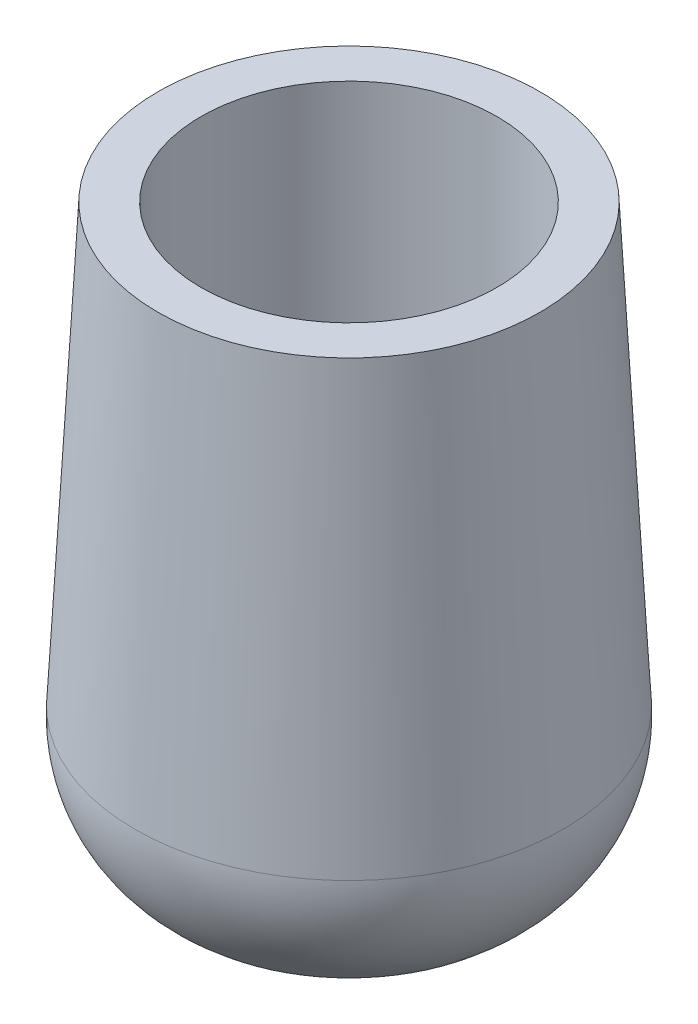
ISO-10303-21;
HEADER;
FILE_DESCRIPTION(('STEP AP214'),'2;1');
FILE_NAME('part.step','',(''),(''),'','','');
FILE_SCHEMA(('AUTOMOTIVE_DESIGN { 1 0 10303 214 1 1 1 1 }'));
ENDSEC;
DATA;
#1=APPLICATION_CONTEXT('core data for automotive mechanical design processes');
#2=APPLICATION_PROTOCOL_DEFINITION('international standard','automotive_design',2000,#1);
#3=PRODUCT_CONTEXT('',#1,'mechanical');
#4=PRODUCT('Part','Part','',(#3));
#5=PRODUCT_RELATED_PRODUCT_CATEGORY('part','',(#4));
#6=PRODUCT_DEFINITION_FORMATION('','',#4);
#7=PRODUCT_DEFINITION_CONTEXT('part definition',#1,'design');
#8=PRODUCT_DEFINITION('design','',#6,#7);
#9=PRODUCT_DEFINITION_SHAPE('','',#8);
#10=(LENGTH_UNIT() NAMED_UNIT(*) SI_UNIT(.MILLI.,.METRE.));
#11=(NAMED_UNIT(*) PLANE_ANGLE_UNIT() SI_UNIT($,.RADIAN.));
#12=(NAMED_UNIT(*) SI_UNIT($,.STERADIAN.) SOLID_ANGLE_UNIT());
#13=UNCERTAINTY_MEASURE_WITH_UNIT(LENGTH_MEASURE(1.E-05),#10,'distance_accuracy_value','');
#14=(GEOMETRIC_REPRESENTATION_CONTEXT(3) GLOBAL_UNCERTAINTY_ASSIGNED_CONTEXT((#13)) GLOBAL_UNIT_ASSIGNED_CONTEXT((#10,
#11,#12)) REPRESENTATION_CONTEXT('',''));
#15=CARTESIAN_POINT('',(0.,0.,0.));
#16=DIRECTION('',(0.,0.,1.));
#17=DIRECTION('',(1.,0.,0.));
#18=AXIS2_PLACEMENT_3D('',#15,#16,#17);
#19=CARTESIAN_POINT('',(0.,0.,0.));
#20=DIRECTION('',(0.,-1.,0.));
#21=DIRECTION('',(0.,0.,1.));
#22=AXIS2_PLACEMENT_3D('',#19,#20,#21);
#23=CONICAL_SURFACE('',#22,4.7625,0.05235987755983);
#24=CARTESIAN_POINT('',(0.,3.34116666107133,0.));
#25=DIRECTION('',(0.,1.,0.));
#26=DIRECTION('',(0.,0.,1.));
#27=AXIS2_PLACEMENT_3D('',#24,#25,#26);
#28=CIRCLE('',#27,4.58739687507872);
#29=CARTESIAN_POINT('',(0.,3.34116666107133,4.58739687507872));
#30=VERTEX_POINT('',#29);
#31=EDGE_CURVE('E39',#30,#30,#28,.T.);
#32=ORIENTED_EDGE('',*,*,#31,.T.);
#33=EDGE_LOOP('',(#32));
#34=FACE_BOUND('',#33,.T.);
#35=CARTESIAN_POINT('',(0.,12.7,0.));
#36=DIRECTION('',(0.,1.,0.));
#37=DIRECTION('',(0.,0.,1.));
#38=AXIS2_PLACEMENT_3D('',#35,#36,#37);
#39=CIRCLE('',#38,4.09692120310538);
#40=CARTESIAN_POINT('',(0.,12.7,4.09692120310538));
#41=VERTEX_POINT('',#40);
#42=EDGE_CURVE('E43',#41,#41,#39,.T.);
#43=ORIENTED_EDGE('',*,*,#42,.F.);
#44=EDGE_LOOP('',(#43));
#45=FACE_BOUND('',#44,.T.);
#46=ADVANCED_FACE('F32',(#34,#45),#23,.T.);
#47=CARTESIAN_POINT('',(0.,12.7,0.));
#48=DIRECTION('',(0.,1.,0.));
#49=DIRECTION('',(0.,0.,1.));
#50=AXIS2_PLACEMENT_3D('',#47,#48,#49);
#51=PLANE('',#50);
#52=CARTESIAN_POINT('',(0.,12.7,0.));
#53=DIRECTION('',(0.,1.,0.));
#54=DIRECTION('',(0.,0.,1.));
#55=AXIS2_PLACEMENT_3D('',#52,#53,#54);
#56=CIRCLE('',#55,3.175);
#57=CARTESIAN_POINT('',(0.,12.7,3.175));
#58=VERTEX_POINT('',#57);
#59=EDGE_CURVE('E50',#58,#58,#56,.T.);
#60=ORIENTED_EDGE('',*,*,#59,.F.);
#61=EDGE_LOOP('',(#60));
#62=FACE_BOUND('',#61,.T.);
#63=ORIENTED_EDGE('',*,*,#42,.T.);
#64=EDGE_LOOP('',(#63));
#65=FACE_BOUND('',#64,.T.);
#66=ADVANCED_FACE('F64',(#62,#65),#51,.T.);
#67=CARTESIAN_POINT('',(0.,0.,0.));
#68=DIRECTION('',(0.,1.,0.));
#69=DIRECTION('',(0.,0.,1.));
#70=AXIS2_PLACEMENT_3D('',#67,#68,#69);
#71=PLANE('',#70);
#72=CARTESIAN_POINT('',(0.,0.,0.));
#73=DIRECTION('',(0.,1.,0.));
#74=DIRECTION('',(0.,0.,1.));
#75=AXIS2_PLACEMENT_3D('',#72,#73,#74);
#76=CIRCLE('',#75,1.41674810223295);
#77=CARTESIAN_POINT('',(0.,0.,1.41674810223295));
#78=VERTEX_POINT('',#77);
#79=EDGE_CURVE('E10',#78,#78,#76,.F.);
#80=ORIENTED_EDGE('',*,*,#79,.T.);
#81=EDGE_LOOP('',(#80));
#82=FACE_BOUND('',#81,.T.);
#83=ADVANCED_FACE('F67',(#82),#71,.F.);
#84=CARTESIAN_POINT('',(0.,3.175,0.));
#85=DIRECTION('',(0.,1.,0.));
#86=DIRECTION('',(0.,0.,1.));
#87=AXIS2_PLACEMENT_3D('',#84,#85,#86);
#88=DEGENERATE_TOROIDAL_SURFACE('',#87,1.41674810223295,3.175,.T.);
#89=ORIENTED_EDGE('',*,*,#79,.F.);
#90=EDGE_LOOP('',(#89));
#91=FACE_BOUND('',#90,.T.);
#92=ORIENTED_EDGE('',*,*,#31,.F.);
#93=EDGE_LOOP('',(#92));
#94=FACE_BOUND('',#93,.T.);
#95=ADVANCED_FACE('F34',(#91,#94),#88,.T.);
#96=CARTESIAN_POINT('',(0.,6.35,0.));
#97=DIRECTION('',(0.,1.,0.));
#98=DIRECTION('',(0.,0.,1.));
#99=AXIS2_PLACEMENT_3D('',#96,#97,#98);
#100=CYLINDRICAL_SURFACE('',#99,3.175);
#101=CARTESIAN_POINT('',(0.,6.35,0.));
#102=DIRECTION('',(0.,1.,0.));
#103=DIRECTION('',(0.,0.,1.));
#104=AXIS2_PLACEMENT_3D('',#101,#102,#103);
#105=CIRCLE('',#104,3.175);
#106=CARTESIAN_POINT('',(0.,6.35,3.175));
#107=VERTEX_POINT('',#106);
#108=EDGE_CURVE('E47',#107,#107,#105,.T.);
#109=ORIENTED_EDGE('',*,*,#108,.F.);
#110=EDGE_LOOP('',(#109));
#111=FACE_BOUND('',#110,.T.);
#112=ORIENTED_EDGE('',*,*,#59,.T.);
#113=EDGE_LOOP('',(#112));
#114=FACE_BOUND('',#113,.T.);
#115=ADVANCED_FACE('F58',(#111,#114),#100,.F.);
#116=CARTESIAN_POINT('',(0.,6.35,0.));
#117=DIRECTION('',(0.,1.,0.));
#118=DIRECTION('',(0.,0.,1.));
#119=AXIS2_PLACEMENT_3D('',#116,#117,#118);
#120=PLANE('',#119);
#121=ORIENTED_EDGE('',*,*,#108,.T.);
#122=EDGE_LOOP('',(#121));
#123=FACE_BOUND('',#122,.T.);
#124=ADVANCED_FACE('F56',(#123),#120,.T.);
#125=CLOSED_SHELL('',(#46,#66,#83,#95,#115,#124));
#126=MANIFOLD_SOLID_BREP('B2',#125);
#127=ADVANCED_BREP_SHAPE_REPRESENTATION('',(#18,#126),#14);
#128=SHAPE_DEFINITION_REPRESENTATION(#9,#127);
ENDSEC;
END-ISO-10303-21;
